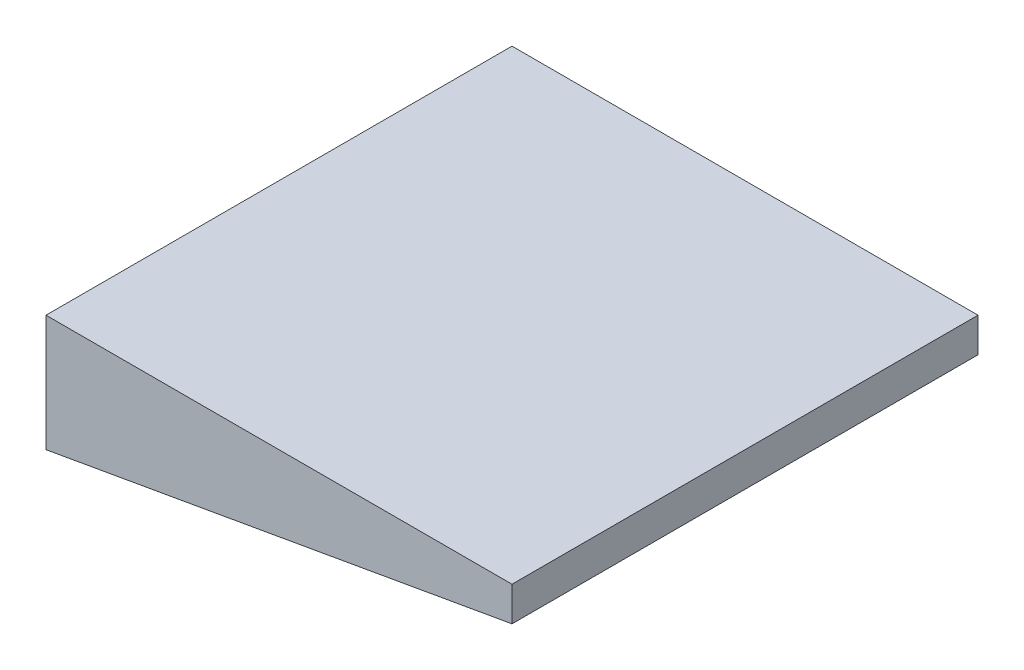
ISO-10303-21;
HEADER;
FILE_DESCRIPTION(('STEP AP214'),'2;1');
FILE_NAME('part.step','',(''),(''),'','','');
FILE_SCHEMA(('AUTOMOTIVE_DESIGN { 1 0 10303 214 1 1 1 1 }'));
ENDSEC;
DATA;
#1=APPLICATION_CONTEXT('core data for automotive mechanical design processes');
#2=APPLICATION_PROTOCOL_DEFINITION('international standard','automotive_design',2000,#1);
#3=PRODUCT_CONTEXT('',#1,'mechanical');
#4=PRODUCT('Part','Part','',(#3));
#5=PRODUCT_RELATED_PRODUCT_CATEGORY('part','',(#4));
#6=PRODUCT_DEFINITION_FORMATION('','',#4);
#7=PRODUCT_DEFINITION_CONTEXT('part definition',#1,'design');
#8=PRODUCT_DEFINITION('design','',#6,#7);
#9=PRODUCT_DEFINITION_SHAPE('','',#8);
#10=(LENGTH_UNIT() NAMED_UNIT(*) SI_UNIT(.MILLI.,.METRE.));
#11=(NAMED_UNIT(*) PLANE_ANGLE_UNIT() SI_UNIT($,.RADIAN.));
#12=(NAMED_UNIT(*) SI_UNIT($,.STERADIAN.) SOLID_ANGLE_UNIT());
#13=UNCERTAINTY_MEASURE_WITH_UNIT(LENGTH_MEASURE(1.E-05),#10,'distance_accuracy_value','');
#14=(GEOMETRIC_REPRESENTATION_CONTEXT(3) GLOBAL_UNCERTAINTY_ASSIGNED_CONTEXT((#13)) GLOBAL_UNIT_ASSIGNED_CONTEXT((#10,
#11,#12)) REPRESENTATION_CONTEXT('',''));
#15=CARTESIAN_POINT('',(0.,0.,0.));
#16=DIRECTION('',(0.,0.,1.));
#17=DIRECTION('',(1.,0.,0.));
#18=AXIS2_PLACEMENT_3D('',#15,#16,#17);
#19=CARTESIAN_POINT('',(3.175,1.5875,3.175));
#20=DIRECTION('',(-1.,0.,0.));
#21=DIRECTION('',(0.,0.,1.));
#22=AXIS2_PLACEMENT_3D('',#19,#20,#21);
#23=PLANE('',#22);
#24=DIRECTION('',(0.,-1.,0.));
#25=VECTOR('',#24,1.);
#26=CARTESIAN_POINT('',(3.175,1.5875,3.175));
#27=LINE('',#26,#25);
#28=CARTESIAN_POINT('',(3.175,1.5875,3.175));
#29=VERTEX_POINT('',#28);
#30=CARTESIAN_POINT('',(3.175,1.11967632749878,3.175));
#31=VERTEX_POINT('',#30);
#32=EDGE_CURVE('E85',#29,#31,#27,.T.);
#33=ORIENTED_EDGE('',*,*,#32,.T.);
#34=DIRECTION('',(0.,0.,1.));
#35=VECTOR('',#34,1.);
#36=CARTESIAN_POINT('',(3.175,1.11967632749878,-3.175));
#37=LINE('',#36,#35);
#38=CARTESIAN_POINT('',(3.175,1.11967632749878,-3.175));
#39=VERTEX_POINT('',#38);
#40=EDGE_CURVE('E72',#39,#31,#37,.T.);
#41=ORIENTED_EDGE('',*,*,#40,.F.);
#42=DIRECTION('',(0.,-1.,0.));
#43=VECTOR('',#42,1.);
#44=CARTESIAN_POINT('',(3.175,1.5875,-3.175));
#45=LINE('',#44,#43);
#46=CARTESIAN_POINT('',(3.175,1.5875,-3.175));
#47=VERTEX_POINT('',#46);
#48=EDGE_CURVE('E11',#47,#39,#45,.T.);
#49=ORIENTED_EDGE('',*,*,#48,.F.);
#50=DIRECTION('',(0.,0.,-1.));
#51=VECTOR('',#50,1.);
#52=CARTESIAN_POINT('',(3.175,1.5875,3.175));
#53=LINE('',#52,#51);
#54=EDGE_CURVE('E91',#29,#47,#53,.T.);
#55=ORIENTED_EDGE('',*,*,#54,.F.);
#56=EDGE_LOOP('',(#33,#41,#49,#55));
#57=FACE_BOUND('',#56,.T.);
#58=ADVANCED_FACE('F33',(#57),#23,.F.);
#59=CARTESIAN_POINT('',(-3.175,1.5875,-3.175));
#60=DIRECTION('',(0.,0.,1.));
#61=DIRECTION('',(1.,0.,0.));
#62=AXIS2_PLACEMENT_3D('',#59,#60,#61);
#63=PLANE('',#62);
#64=ORIENTED_EDGE('',*,*,#48,.T.);
#65=DIRECTION('',(-0.984807753012207,-0.173648177666935,0.));
#66=VECTOR('',#65,1.);
#67=CARTESIAN_POINT('',(-3.175,0.,-3.175));
#68=LINE('',#67,#66);
#69=CARTESIAN_POINT('',(-3.175,0.,-3.175));
#70=VERTEX_POINT('',#69);
#71=EDGE_CURVE('E68',#39,#70,#68,.T.);
#72=ORIENTED_EDGE('',*,*,#71,.T.);
#73=DIRECTION('',(0.,-1.,0.));
#74=VECTOR('',#73,1.);
#75=CARTESIAN_POINT('',(-3.175,1.5875,-3.175));
#76=LINE('',#75,#74);
#77=CARTESIAN_POINT('',(-3.175,1.5875,-3.175));
#78=VERTEX_POINT('',#77);
#79=EDGE_CURVE('E41',#78,#70,#76,.T.);
#80=ORIENTED_EDGE('',*,*,#79,.F.);
#81=DIRECTION('',(-1.,0.,0.));
#82=VECTOR('',#81,1.);
#83=CARTESIAN_POINT('',(-3.175,1.5875,-3.175));
#84=LINE('',#83,#82);
#85=EDGE_CURVE('E88',#47,#78,#84,.T.);
#86=ORIENTED_EDGE('',*,*,#85,.F.);
#87=EDGE_LOOP('',(#64,#72,#80,#86));
#88=FACE_BOUND('',#87,.T.);
#89=ADVANCED_FACE('F87',(#88),#63,.F.);
#90=CARTESIAN_POINT('',(-3.175,1.5875,3.175));
#91=DIRECTION('',(1.,0.,0.));
#92=DIRECTION('',(0.,0.,-1.));
#93=AXIS2_PLACEMENT_3D('',#90,#91,#92);
#94=PLANE('',#93);
#95=DIRECTION('',(0.,0.,1.));
#96=VECTOR('',#95,1.);
#97=CARTESIAN_POINT('',(-3.175,0.,3.175));
#98=LINE('',#97,#96);
#99=CARTESIAN_POINT('',(-3.175,0.,3.175));
#100=VERTEX_POINT('',#99);
#101=EDGE_CURVE('E75',#70,#100,#98,.T.);
#102=ORIENTED_EDGE('',*,*,#101,.T.);
#103=DIRECTION('',(0.,-1.,0.));
#104=VECTOR('',#103,1.);
#105=CARTESIAN_POINT('',(-3.175,1.5875,3.175));
#106=LINE('',#105,#104);
#107=CARTESIAN_POINT('',(-3.175,1.5875,3.175));
#108=VERTEX_POINT('',#107);
#109=EDGE_CURVE('E101',#108,#100,#106,.T.);
#110=ORIENTED_EDGE('',*,*,#109,.F.);
#111=DIRECTION('',(0.,0.,1.));
#112=VECTOR('',#111,1.);
#113=CARTESIAN_POINT('',(-3.175,1.5875,3.175));
#114=LINE('',#113,#112);
#115=EDGE_CURVE('E90',#78,#108,#114,.T.);
#116=ORIENTED_EDGE('',*,*,#115,.F.);
#117=ORIENTED_EDGE('',*,*,#79,.T.);
#118=EDGE_LOOP('',(#102,#110,#116,#117));
#119=FACE_BOUND('',#118,.T.);
#120=ADVANCED_FACE('F104',(#119),#94,.F.);
#121=CARTESIAN_POINT('',(-3.175,1.5875,3.175));
#122=DIRECTION('',(0.,0.,-1.));
#123=DIRECTION('',(-1.,0.,0.));
#124=AXIS2_PLACEMENT_3D('',#121,#122,#123);
#125=PLANE('',#124);
#126=ORIENTED_EDGE('',*,*,#109,.T.);
#127=DIRECTION('',(-0.984807753012207,-0.173648177666935,0.));
#128=VECTOR('',#127,1.);
#129=CARTESIAN_POINT('',(-3.175,0.,3.175));
#130=LINE('',#129,#128);
#131=EDGE_CURVE('E79',#31,#100,#130,.T.);
#132=ORIENTED_EDGE('',*,*,#131,.F.);
#133=ORIENTED_EDGE('',*,*,#32,.F.);
#134=DIRECTION('',(1.,0.,0.));
#135=VECTOR('',#134,1.);
#136=CARTESIAN_POINT('',(-3.175,1.5875,3.175));
#137=LINE('',#136,#135);
#138=EDGE_CURVE('E48',#108,#29,#137,.T.);
#139=ORIENTED_EDGE('',*,*,#138,.F.);
#140=EDGE_LOOP('',(#126,#132,#133,#139));
#141=FACE_BOUND('',#140,.T.);
#142=ADVANCED_FACE('F107',(#141),#125,.F.);
#143=CARTESIAN_POINT('',(0.,1.5875,0.));
#144=DIRECTION('',(0.,-1.,0.));
#145=DIRECTION('',(0.,0.,-1.));
#146=AXIS2_PLACEMENT_3D('',#143,#144,#145);
#147=PLANE('',#146);
#148=ORIENTED_EDGE('',*,*,#54,.T.);
#149=ORIENTED_EDGE('',*,*,#85,.T.);
#150=ORIENTED_EDGE('',*,*,#115,.T.);
#151=ORIENTED_EDGE('',*,*,#138,.T.);
#152=EDGE_LOOP('',(#148,#149,#150,#151));
#153=FACE_BOUND('',#152,.T.);
#154=ADVANCED_FACE('F93',(#153),#147,.F.);
#155=CARTESIAN_POINT('',(-3.175,0.,-3.175));
#156=DIRECTION('',(-0.173648177666935,0.984807753012207,0.));
#157=DIRECTION('',(-0.984807753012207,-0.173648177666935,0.));
#158=AXIS2_PLACEMENT_3D('',#155,#156,#157);
#159=PLANE('',#158);
#160=ORIENTED_EDGE('',*,*,#131,.T.);
#161=ORIENTED_EDGE('',*,*,#101,.F.);
#162=ORIENTED_EDGE('',*,*,#71,.F.);
#163=ORIENTED_EDGE('',*,*,#40,.T.);
#164=EDGE_LOOP('',(#160,#161,#162,#163));
#165=FACE_BOUND('',#164,.T.);
#166=ADVANCED_FACE('F71',(#165),#159,.F.);
#167=CLOSED_SHELL('',(#58,#89,#120,#142,#154,#166));
#168=MANIFOLD_SOLID_BREP('B2',#167);
#169=ADVANCED_BREP_SHAPE_REPRESENTATION('',(#18,#168),#14);
#170=SHAPE_DEFINITION_REPRESENTATION(#9,#169);
ENDSEC;
END-ISO-10303-21;
